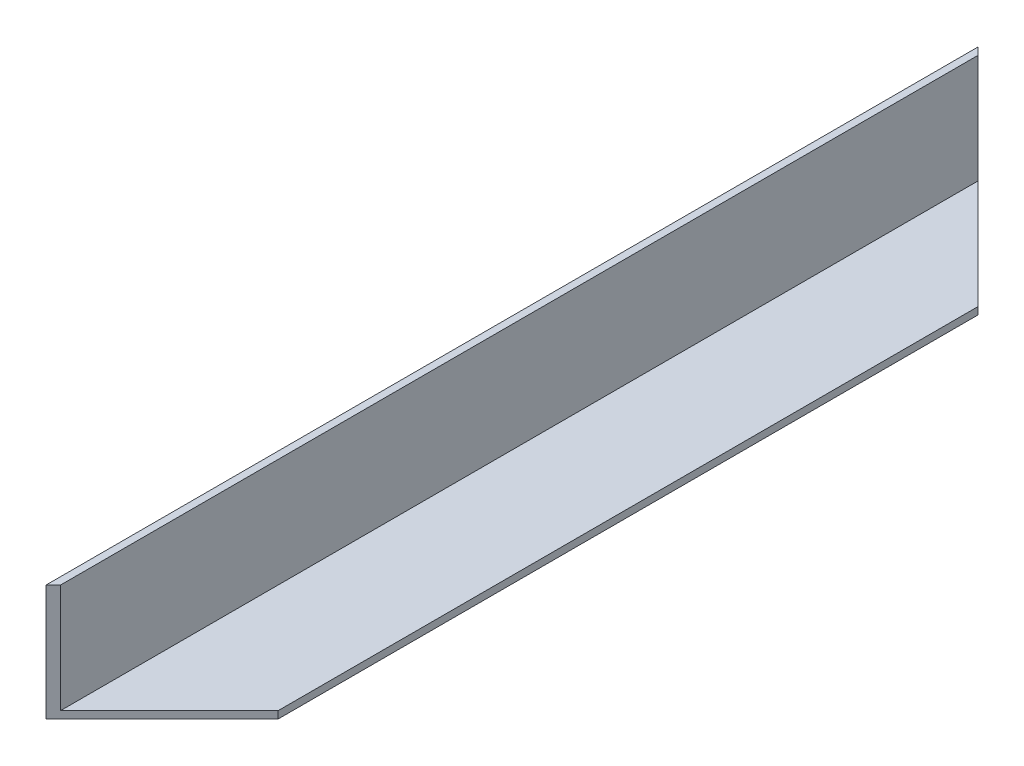
ISO-10303-21;
HEADER;
FILE_DESCRIPTION(('STEP AP214'),'2;1');
FILE_NAME('part.step','',(''),(''),'','','');
FILE_SCHEMA(('AUTOMOTIVE_DESIGN { 1 0 10303 214 1 1 1 1 }'));
ENDSEC;
DATA;
#1=APPLICATION_CONTEXT('core data for automotive mechanical design processes');
#2=APPLICATION_PROTOCOL_DEFINITION('international standard','automotive_design',2000,#1);
#3=PRODUCT_CONTEXT('',#1,'mechanical');
#4=PRODUCT('Part','Part','',(#3));
#5=PRODUCT_RELATED_PRODUCT_CATEGORY('part','',(#4));
#6=PRODUCT_DEFINITION_FORMATION('','',#4);
#7=PRODUCT_DEFINITION_CONTEXT('part definition',#1,'design');
#8=PRODUCT_DEFINITION('design','',#6,#7);
#9=PRODUCT_DEFINITION_SHAPE('','',#8);
#10=(LENGTH_UNIT() NAMED_UNIT(*) SI_UNIT(.MILLI.,.METRE.));
#11=(NAMED_UNIT(*) PLANE_ANGLE_UNIT() SI_UNIT($,.RADIAN.));
#12=(NAMED_UNIT(*) SI_UNIT($,.STERADIAN.) SOLID_ANGLE_UNIT());
#13=UNCERTAINTY_MEASURE_WITH_UNIT(LENGTH_MEASURE(1.E-05),#10,'distance_accuracy_value','');
#14=(GEOMETRIC_REPRESENTATION_CONTEXT(3) GLOBAL_UNCERTAINTY_ASSIGNED_CONTEXT((#13)) GLOBAL_UNIT_ASSIGNED_CONTEXT((#10,
#11,#12)) REPRESENTATION_CONTEXT('',''));
#15=CARTESIAN_POINT('',(0.,0.,0.));
#16=DIRECTION('',(0.,0.,1.));
#17=DIRECTION('',(1.,0.,0.));
#18=AXIS2_PLACEMENT_3D('',#15,#16,#17);
#19=CARTESIAN_POINT('',(0.,-2.,257.));
#20=DIRECTION('',(0.,1.,0.));
#21=DIRECTION('',(0.,0.,1.));
#22=AXIS2_PLACEMENT_3D('',#19,#20,#21);
#23=PLANE('',#22);
#24=DIRECTION('',(-0.707106781186548,0.,0.707106781186548));
#25=VECTOR('',#24,1.);
#26=CARTESIAN_POINT('',(-2.,-2.,257.));
#27=LINE('',#26,#25);
#28=CARTESIAN_POINT('',(30.,-2.,225.));
#29=VERTEX_POINT('',#28);
#30=CARTESIAN_POINT('',(-2.,-2.,257.));
#31=VERTEX_POINT('',#30);
#32=EDGE_CURVE('E79',#29,#31,#27,.T.);
#33=ORIENTED_EDGE('',*,*,#32,.T.);
#34=DIRECTION('',(0.,0.,-1.));
#35=VECTOR('',#34,1.);
#36=CARTESIAN_POINT('',(-2.,-2.,257.));
#37=LINE('',#36,#35);
#38=CARTESIAN_POINT('',(-2.,-2.,0.));
#39=VERTEX_POINT('',#38);
#40=EDGE_CURVE('E100',#31,#39,#37,.T.);
#41=ORIENTED_EDGE('',*,*,#40,.T.);
#42=DIRECTION('',(0.707106781186548,0.,0.707106781186548));
#43=VECTOR('',#42,1.);
#44=CARTESIAN_POINT('',(-2.,-2.,0.));
#45=LINE('',#44,#43);
#46=CARTESIAN_POINT('',(30.,-2.,32.));
#47=VERTEX_POINT('',#46);
#48=EDGE_CURVE('E99',#39,#47,#45,.T.);
#49=ORIENTED_EDGE('',*,*,#48,.T.);
#50=DIRECTION('',(0.,0.,-1.));
#51=VECTOR('',#50,1.);
#52=CARTESIAN_POINT('',(30.,-2.,257.));
#53=LINE('',#52,#51);
#54=EDGE_CURVE('E11',#29,#47,#53,.T.);
#55=ORIENTED_EDGE('',*,*,#54,.F.);
#56=EDGE_LOOP('',(#33,#41,#49,#55));
#57=FACE_BOUND('',#56,.T.);
#58=ADVANCED_FACE('F34',(#57),#23,.F.);
#59=CARTESIAN_POINT('',(30.,0.,257.));
#60=DIRECTION('',(1.,0.,0.));
#61=DIRECTION('',(0.,0.,-1.));
#62=AXIS2_PLACEMENT_3D('',#59,#60,#61);
#63=PLANE('',#62);
#64=DIRECTION('',(0.,0.,-1.));
#65=VECTOR('',#64,1.);
#66=CARTESIAN_POINT('',(30.,0.,257.));
#67=LINE('',#66,#65);
#68=CARTESIAN_POINT('',(30.,0.,225.));
#69=VERTEX_POINT('',#68);
#70=CARTESIAN_POINT('',(30.,0.,32.));
#71=VERTEX_POINT('',#70);
#72=EDGE_CURVE('E42',#69,#71,#67,.T.);
#73=ORIENTED_EDGE('',*,*,#72,.F.);
#74=DIRECTION('',(0.,-1.,0.));
#75=VECTOR('',#74,1.);
#76=CARTESIAN_POINT('',(30.,30.,225.));
#77=LINE('',#76,#75);
#78=EDGE_CURVE('E82',#69,#29,#77,.T.);
#79=ORIENTED_EDGE('',*,*,#78,.T.);
#80=ORIENTED_EDGE('',*,*,#54,.T.);
#81=DIRECTION('',(0.,-1.,0.));
#82=VECTOR('',#81,1.);
#83=CARTESIAN_POINT('',(30.,30.,32.));
#84=LINE('',#83,#82);
#85=EDGE_CURVE('E107',#71,#47,#84,.T.);
#86=ORIENTED_EDGE('',*,*,#85,.F.);
#87=EDGE_LOOP('',(#73,#79,#80,#86));
#88=FACE_BOUND('',#87,.T.);
#89=ADVANCED_FACE('F93',(#88),#63,.T.);
#90=CARTESIAN_POINT('',(0.,0.,257.));
#91=DIRECTION('',(0.,1.,0.));
#92=DIRECTION('',(0.,0.,1.));
#93=AXIS2_PLACEMENT_3D('',#90,#91,#92);
#94=PLANE('',#93);
#95=DIRECTION('',(0.,0.,-1.));
#96=VECTOR('',#95,1.);
#97=CARTESIAN_POINT('',(0.,0.,257.));
#98=LINE('',#97,#96);
#99=CARTESIAN_POINT('',(0.,0.,255.));
#100=VERTEX_POINT('',#99);
#101=CARTESIAN_POINT('',(0.,0.,2.));
#102=VERTEX_POINT('',#101);
#103=EDGE_CURVE('E127',#100,#102,#98,.T.);
#104=ORIENTED_EDGE('',*,*,#103,.F.);
#105=DIRECTION('',(0.707106781186548,0.,-0.707106781186548));
#106=VECTOR('',#105,1.);
#107=CARTESIAN_POINT('',(-1.,0.,256.));
#108=LINE('',#107,#106);
#109=EDGE_CURVE('E104',#100,#69,#108,.T.);
#110=ORIENTED_EDGE('',*,*,#109,.T.);
#111=ORIENTED_EDGE('',*,*,#72,.T.);
#112=DIRECTION('',(-0.707106781186548,0.,-0.707106781186548));
#113=VECTOR('',#112,1.);
#114=CARTESIAN_POINT('',(127.5,0.,129.5));
#115=LINE('',#114,#113);
#116=EDGE_CURVE('E115',#71,#102,#115,.T.);
#117=ORIENTED_EDGE('',*,*,#116,.T.);
#118=EDGE_LOOP('',(#104,#110,#111,#117));
#119=FACE_BOUND('',#118,.T.);
#120=ADVANCED_FACE('F131',(#119),#94,.T.);
#121=CARTESIAN_POINT('',(0.,0.,257.));
#122=DIRECTION('',(1.,0.,0.));
#123=DIRECTION('',(0.,0.,-1.));
#124=AXIS2_PLACEMENT_3D('',#121,#122,#123);
#125=PLANE('',#124);
#126=DIRECTION('',(0.,0.,-1.));
#127=VECTOR('',#126,1.);
#128=CARTESIAN_POINT('',(0.,30.,257.));
#129=LINE('',#128,#127);
#130=CARTESIAN_POINT('',(0.,30.,255.));
#131=VERTEX_POINT('',#130);
#132=CARTESIAN_POINT('',(0.,30.,2.));
#133=VERTEX_POINT('',#132);
#134=EDGE_CURVE('E125',#131,#133,#129,.T.);
#135=ORIENTED_EDGE('',*,*,#134,.F.);
#136=DIRECTION('',(0.,-1.,0.));
#137=VECTOR('',#136,1.);
#138=CARTESIAN_POINT('',(0.,0.,255.));
#139=LINE('',#138,#137);
#140=EDGE_CURVE('E96',#131,#100,#139,.T.);
#141=ORIENTED_EDGE('',*,*,#140,.T.);
#142=ORIENTED_EDGE('',*,*,#103,.T.);
#143=DIRECTION('',(0.,1.,0.));
#144=VECTOR('',#143,1.);
#145=CARTESIAN_POINT('',(0.,0.,2.));
#146=LINE('',#145,#144);
#147=EDGE_CURVE('E112',#102,#133,#146,.T.);
#148=ORIENTED_EDGE('',*,*,#147,.T.);
#149=EDGE_LOOP('',(#135,#141,#142,#148));
#150=FACE_BOUND('',#149,.T.);
#151=ADVANCED_FACE('F137',(#150),#125,.T.);
#152=CARTESIAN_POINT('',(-2.,30.,257.));
#153=DIRECTION('',(0.,1.,0.));
#154=DIRECTION('',(0.,0.,1.));
#155=AXIS2_PLACEMENT_3D('',#152,#153,#154);
#156=PLANE('',#155);
#157=DIRECTION('',(0.,0.,-1.));
#158=VECTOR('',#157,1.);
#159=CARTESIAN_POINT('',(-2.,30.,257.));
#160=LINE('',#159,#158);
#161=CARTESIAN_POINT('',(-2.,30.,257.));
#162=VERTEX_POINT('',#161);
#163=CARTESIAN_POINT('',(-2.,30.,0.));
#164=VERTEX_POINT('',#163);
#165=EDGE_CURVE('E122',#162,#164,#160,.T.);
#166=ORIENTED_EDGE('',*,*,#165,.F.);
#167=DIRECTION('',(-0.707106781186548,0.,0.707106781186548));
#168=VECTOR('',#167,1.);
#169=CARTESIAN_POINT('',(-2.,30.,257.));
#170=LINE('',#169,#168);
#171=EDGE_CURVE('E48',#131,#162,#170,.T.);
#172=ORIENTED_EDGE('',*,*,#171,.F.);
#173=ORIENTED_EDGE('',*,*,#134,.T.);
#174=DIRECTION('',(0.707106781186548,0.,0.707106781186548));
#175=VECTOR('',#174,1.);
#176=CARTESIAN_POINT('',(-2.,30.,0.));
#177=LINE('',#176,#175);
#178=EDGE_CURVE('E103',#164,#133,#177,.T.);
#179=ORIENTED_EDGE('',*,*,#178,.F.);
#180=EDGE_LOOP('',(#166,#172,#173,#179));
#181=FACE_BOUND('',#180,.T.);
#182=ADVANCED_FACE('F142',(#181),#156,.T.);
#183=CARTESIAN_POINT('',(-2.,0.,257.));
#184=DIRECTION('',(1.,0.,0.));
#185=DIRECTION('',(0.,0.,-1.));
#186=AXIS2_PLACEMENT_3D('',#183,#184,#185);
#187=PLANE('',#186);
#188=DIRECTION('',(0.,1.,0.));
#189=VECTOR('',#188,1.);
#190=CARTESIAN_POINT('',(-2.,0.,0.));
#191=LINE('',#190,#189);
#192=EDGE_CURVE('E118',#164,#39,#191,.F.);
#193=ORIENTED_EDGE('',*,*,#192,.T.);
#194=ORIENTED_EDGE('',*,*,#40,.F.);
#195=DIRECTION('',(0.,1.,0.));
#196=VECTOR('',#195,1.);
#197=CARTESIAN_POINT('',(-2.,0.,257.));
#198=LINE('',#197,#196);
#199=EDGE_CURVE('E85',#162,#31,#198,.F.);
#200=ORIENTED_EDGE('',*,*,#199,.F.);
#201=ORIENTED_EDGE('',*,*,#165,.T.);
#202=EDGE_LOOP('',(#193,#194,#200,#201));
#203=FACE_BOUND('',#202,.T.);
#204=ADVANCED_FACE('F144',(#203),#187,.F.);
#205=CARTESIAN_POINT('',(-2.,30.,0.));
#206=DIRECTION('',(0.707106781186547,0.,-0.707106781186547));
#207=DIRECTION('',(-0.707106781186548,0.,-0.707106781186548));
#208=AXIS2_PLACEMENT_3D('',#205,#206,#207);
#209=PLANE('',#208);
#210=ORIENTED_EDGE('',*,*,#85,.T.);
#211=ORIENTED_EDGE('',*,*,#48,.F.);
#212=ORIENTED_EDGE('',*,*,#192,.F.);
#213=ORIENTED_EDGE('',*,*,#178,.T.);
#214=ORIENTED_EDGE('',*,*,#147,.F.);
#215=ORIENTED_EDGE('',*,*,#116,.F.);
#216=EDGE_LOOP('',(#210,#211,#212,#213,#214,#215));
#217=FACE_BOUND('',#216,.T.);
#218=ADVANCED_FACE('F133',(#217),#209,.T.);
#219=CARTESIAN_POINT('',(-2.,30.,257.));
#220=DIRECTION('',(0.707106781186547,0.,0.707106781186547));
#221=DIRECTION('',(0.707106781186548,0.,-0.707106781186548));
#222=AXIS2_PLACEMENT_3D('',#219,#220,#221);
#223=PLANE('',#222);
#224=ORIENTED_EDGE('',*,*,#140,.F.);
#225=ORIENTED_EDGE('',*,*,#171,.T.);
#226=ORIENTED_EDGE('',*,*,#199,.T.);
#227=ORIENTED_EDGE('',*,*,#32,.F.);
#228=ORIENTED_EDGE('',*,*,#78,.F.);
#229=ORIENTED_EDGE('',*,*,#109,.F.);
#230=EDGE_LOOP('',(#224,#225,#226,#227,#228,#229));
#231=FACE_BOUND('',#230,.T.);
#232=ADVANCED_FACE('F81',(#231),#223,.T.);
#233=CLOSED_SHELL('',(#58,#89,#120,#151,#182,#204,#218,#232));
#234=MANIFOLD_SOLID_BREP('B2',#233);
#235=ADVANCED_BREP_SHAPE_REPRESENTATION('',(#18,#234),#14);
#236=SHAPE_DEFINITION_REPRESENTATION(#9,#235);
ENDSEC;
END-ISO-10303-21;
